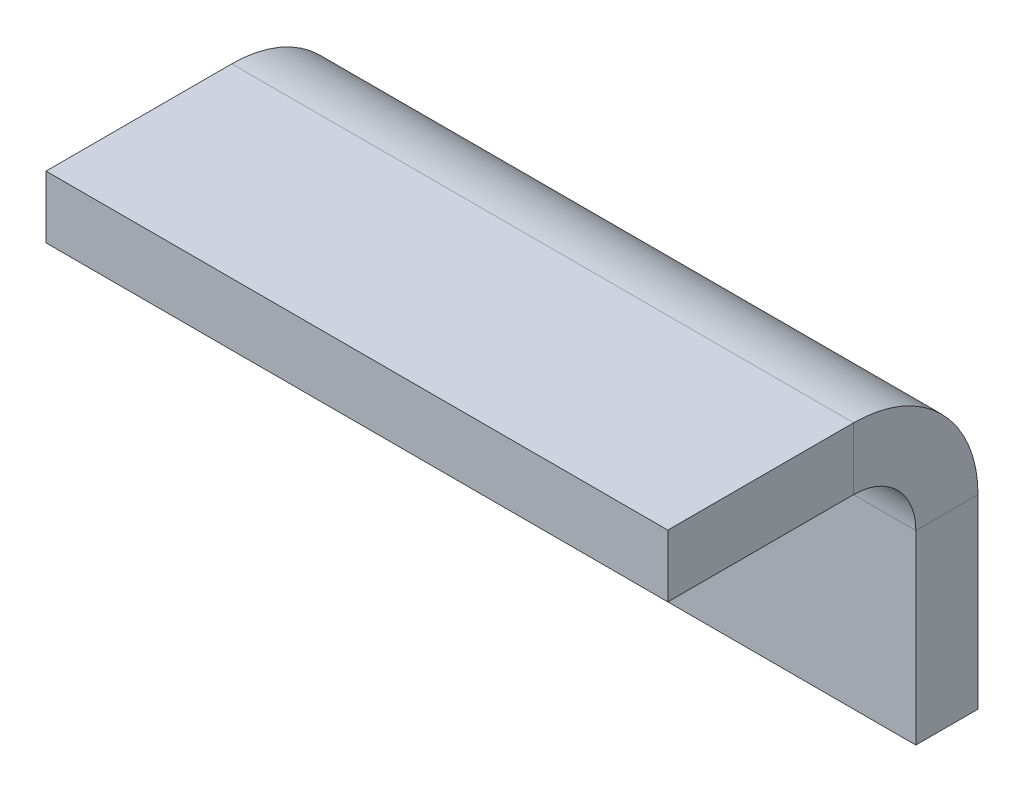
ISO-10303-21;
HEADER;
FILE_DESCRIPTION(('STEP AP214'),'2;1');
FILE_NAME('part.step','',(''),(''),'','','');
FILE_SCHEMA(('AUTOMOTIVE_DESIGN { 1 0 10303 214 1 1 1 1 }'));
ENDSEC;
DATA;
#1=APPLICATION_CONTEXT('core data for automotive mechanical design processes');
#2=APPLICATION_PROTOCOL_DEFINITION('international standard','automotive_design',2000,#1);
#3=PRODUCT_CONTEXT('',#1,'mechanical');
#4=PRODUCT('Part','Part','',(#3));
#5=PRODUCT_RELATED_PRODUCT_CATEGORY('part','',(#4));
#6=PRODUCT_DEFINITION_FORMATION('','',#4);
#7=PRODUCT_DEFINITION_CONTEXT('part definition',#1,'design');
#8=PRODUCT_DEFINITION('design','',#6,#7);
#9=PRODUCT_DEFINITION_SHAPE('','',#8);
#10=(LENGTH_UNIT() NAMED_UNIT(*) SI_UNIT(.MILLI.,.METRE.));
#11=(NAMED_UNIT(*) PLANE_ANGLE_UNIT() SI_UNIT($,.RADIAN.));
#12=(NAMED_UNIT(*) SI_UNIT($,.STERADIAN.) SOLID_ANGLE_UNIT());
#13=UNCERTAINTY_MEASURE_WITH_UNIT(LENGTH_MEASURE(1.E-05),#10,'distance_accuracy_value','');
#14=(GEOMETRIC_REPRESENTATION_CONTEXT(3) GLOBAL_UNCERTAINTY_ASSIGNED_CONTEXT((#13)) GLOBAL_UNIT_ASSIGNED_CONTEXT((#10,
#11,#12)) REPRESENTATION_CONTEXT('',''));
#15=CARTESIAN_POINT('',(0.,0.,0.));
#16=DIRECTION('',(0.,0.,1.));
#17=DIRECTION('',(1.,0.,0.));
#18=AXIS2_PLACEMENT_3D('',#15,#16,#17);
#19=CARTESIAN_POINT('',(0.,2.4657082647115,-0.534291735288522));
#20=DIRECTION('',(0.,-1.,0.));
#21=DIRECTION('',(1.,0.,0.));
#22=AXIS2_PLACEMENT_3D('',#19,#20,#21);
#23=PLANE('',#22);
#24=DIRECTION('',(0.,0.,1.));
#25=VECTOR('',#24,1.);
#26=CARTESIAN_POINT('',(15.,2.46570826471146,11.9657082647115));
#27=LINE('',#26,#25);
#28=CARTESIAN_POINT('',(15.,2.46570826471149,3.00000000000002));
#29=VERTEX_POINT('',#28);
#30=CARTESIAN_POINT('',(15.,2.46570826471146,11.9657082647115));
#31=VERTEX_POINT('',#30);
#32=EDGE_CURVE('E42',#29,#31,#27,.T.);
#33=ORIENTED_EDGE('',*,*,#32,.F.);
#34=DIRECTION('',(-1.,0.,0.));
#35=VECTOR('',#34,1.);
#36=CARTESIAN_POINT('',(0.,2.46570826471149,3.00000000000002));
#37=LINE('',#36,#35);
#38=CARTESIAN_POINT('',(-15.,2.46570826471149,3.00000000000002));
#39=VERTEX_POINT('',#38);
#40=EDGE_CURVE('E129',#29,#39,#37,.T.);
#41=ORIENTED_EDGE('',*,*,#40,.T.);
#42=DIRECTION('',(0.,0.,-1.));
#43=VECTOR('',#42,1.);
#44=CARTESIAN_POINT('',(-15.,2.46570826471146,11.9657082647115));
#45=LINE('',#44,#43);
#46=CARTESIAN_POINT('',(-15.,2.46570826471146,11.9657082647115));
#47=VERTEX_POINT('',#46);
#48=EDGE_CURVE('E156',#47,#39,#45,.T.);
#49=ORIENTED_EDGE('',*,*,#48,.F.);
#50=DIRECTION('',(-1.,0.,0.));
#51=VECTOR('',#50,1.);
#52=CARTESIAN_POINT('',(-15.,2.46570826471146,11.9657082647115));
#53=LINE('',#52,#51);
#54=EDGE_CURVE('E150',#31,#47,#53,.T.);
#55=ORIENTED_EDGE('',*,*,#54,.F.);
#56=EDGE_LOOP('',(#33,#41,#49,#55));
#57=FACE_BOUND('',#56,.T.);
#58=ADVANCED_FACE('F38',(#57),#23,.F.);
#59=CARTESIAN_POINT('',(-15.,2.46570826471146,11.9657082647115));
#60=DIRECTION('',(-1.,0.,0.));
#61=DIRECTION('',(0.,0.,-1.));
#62=AXIS2_PLACEMENT_3D('',#59,#60,#61);
#63=PLANE('',#62);
#64=DIRECTION('',(0.,1.,0.));
#65=VECTOR('',#64,1.);
#66=CARTESIAN_POINT('',(-15.,2.46570826471156,3.00000000000002));
#67=LINE('',#66,#65);
#68=CARTESIAN_POINT('',(-15.,-0.534291735288507,2.99999999999999));
#69=VERTEX_POINT('',#68);
#70=EDGE_CURVE('E12',#69,#39,#67,.T.);
#71=ORIENTED_EDGE('',*,*,#70,.F.);
#72=DIRECTION('',(0.,0.,-1.));
#73=VECTOR('',#72,1.);
#74=CARTESIAN_POINT('',(-15.,-0.534291735288539,11.9657082647115));
#75=LINE('',#74,#73);
#76=CARTESIAN_POINT('',(-15.,-0.534291735288539,11.9657082647115));
#77=VERTEX_POINT('',#76);
#78=EDGE_CURVE('E55',#77,#69,#75,.T.);
#79=ORIENTED_EDGE('',*,*,#78,.F.);
#80=DIRECTION('',(0.,-1.,0.));
#81=VECTOR('',#80,1.);
#82=CARTESIAN_POINT('',(-15.,2.46570826471146,11.9657082647115));
#83=LINE('',#82,#81);
#84=EDGE_CURVE('E157',#47,#77,#83,.T.);
#85=ORIENTED_EDGE('',*,*,#84,.F.);
#86=ORIENTED_EDGE('',*,*,#48,.T.);
#87=EDGE_LOOP('',(#71,#79,#85,#86));
#88=FACE_BOUND('',#87,.T.);
#89=ADVANCED_FACE('F40',(#88),#63,.T.);
#90=CARTESIAN_POINT('',(-15.,2.46570826471146,11.9657082647115));
#91=DIRECTION('',(0.,0.,1.));
#92=DIRECTION('',(0.,-1.,0.));
#93=AXIS2_PLACEMENT_3D('',#90,#91,#92);
#94=PLANE('',#93);
#95=DIRECTION('',(-1.,0.,0.));
#96=VECTOR('',#95,1.);
#97=CARTESIAN_POINT('',(-15.,-0.534291735288539,11.9657082647115));
#98=LINE('',#97,#96);
#99=CARTESIAN_POINT('',(15.,-0.534291735288539,11.9657082647115));
#100=VERTEX_POINT('',#99);
#101=EDGE_CURVE('E154',#100,#77,#98,.T.);
#102=ORIENTED_EDGE('',*,*,#101,.F.);
#103=DIRECTION('',(0.,-1.,0.));
#104=VECTOR('',#103,1.);
#105=CARTESIAN_POINT('',(15.,2.46570826471146,11.9657082647115));
#106=LINE('',#105,#104);
#107=EDGE_CURVE('E153',#31,#100,#106,.T.);
#108=ORIENTED_EDGE('',*,*,#107,.F.);
#109=ORIENTED_EDGE('',*,*,#54,.T.);
#110=ORIENTED_EDGE('',*,*,#84,.T.);
#111=EDGE_LOOP('',(#102,#108,#109,#110));
#112=FACE_BOUND('',#111,.T.);
#113=ADVANCED_FACE('F173',(#112),#94,.T.);
#114=CARTESIAN_POINT('',(15.,2.46570826471146,11.9657082647115));
#115=DIRECTION('',(1.,0.,0.));
#116=DIRECTION('',(0.,0.,1.));
#117=AXIS2_PLACEMENT_3D('',#114,#115,#116);
#118=PLANE('',#117);
#119=DIRECTION('',(0.,-1.,0.));
#120=VECTOR('',#119,1.);
#121=CARTESIAN_POINT('',(15.,2.46570826471156,3.00000000000002));
#122=LINE('',#121,#120);
#123=CARTESIAN_POINT('',(15.,-0.534291735288507,2.99999999999999));
#124=VERTEX_POINT('',#123);
#125=EDGE_CURVE('E161',#29,#124,#122,.T.);
#126=ORIENTED_EDGE('',*,*,#125,.F.);
#127=ORIENTED_EDGE('',*,*,#32,.T.);
#128=ORIENTED_EDGE('',*,*,#107,.T.);
#129=DIRECTION('',(0.,0.,1.));
#130=VECTOR('',#129,1.);
#131=CARTESIAN_POINT('',(15.,-0.534291735288539,11.9657082647115));
#132=LINE('',#131,#130);
#133=EDGE_CURVE('E63',#124,#100,#132,.T.);
#134=ORIENTED_EDGE('',*,*,#133,.F.);
#135=EDGE_LOOP('',(#126,#127,#128,#134));
#136=FACE_BOUND('',#135,.T.);
#137=ADVANCED_FACE('F170',(#136),#118,.T.);
#138=CARTESIAN_POINT('',(0.,-0.534291735288495,-0.534291735288532));
#139=DIRECTION('',(0.,-1.,0.));
#140=DIRECTION('',(1.,0.,0.));
#141=AXIS2_PLACEMENT_3D('',#138,#139,#140);
#142=PLANE('',#141);
#143=DIRECTION('',(-1.,0.,0.));
#144=VECTOR('',#143,1.);
#145=CARTESIAN_POINT('',(0.,-0.534291735288507,2.99999999999999));
#146=LINE('',#145,#144);
#147=EDGE_CURVE('E47',#124,#69,#146,.T.);
#148=ORIENTED_EDGE('',*,*,#147,.F.);
#149=ORIENTED_EDGE('',*,*,#133,.T.);
#150=ORIENTED_EDGE('',*,*,#101,.T.);
#151=ORIENTED_EDGE('',*,*,#78,.T.);
#152=EDGE_LOOP('',(#148,#149,#150,#151));
#153=FACE_BOUND('',#152,.T.);
#154=ADVANCED_FACE('F167',(#153),#142,.T.);
#155=CARTESIAN_POINT('',(-15.,-12.5,-3.));
#156=DIRECTION('',(0.,-1.,0.));
#157=DIRECTION('',(0.,0.,-1.));
#158=AXIS2_PLACEMENT_3D('',#155,#156,#157);
#159=PLANE('',#158);
#160=DIRECTION('',(1.,0.,0.));
#161=VECTOR('',#160,1.);
#162=CARTESIAN_POINT('',(-15.,-12.5,0.));
#163=LINE('',#162,#161);
#164=CARTESIAN_POINT('',(-15.,-12.5,0.));
#165=VERTEX_POINT('',#164);
#166=CARTESIAN_POINT('',(15.,-12.5,0.));
#167=VERTEX_POINT('',#166);
#168=EDGE_CURVE('E195',#165,#167,#163,.T.);
#169=ORIENTED_EDGE('',*,*,#168,.F.);
#170=DIRECTION('',(0.,0.,1.));
#171=VECTOR('',#170,1.);
#172=CARTESIAN_POINT('',(-15.,-12.5,-3.));
#173=LINE('',#172,#171);
#174=CARTESIAN_POINT('',(-15.,-12.5,-3.));
#175=VERTEX_POINT('',#174);
#176=EDGE_CURVE('E166',#175,#165,#173,.T.);
#177=ORIENTED_EDGE('',*,*,#176,.F.);
#178=DIRECTION('',(1.,0.,0.));
#179=VECTOR('',#178,1.);
#180=CARTESIAN_POINT('',(-15.,-12.5,-3.));
#181=LINE('',#180,#179);
#182=CARTESIAN_POINT('',(15.,-12.5,-3.));
#183=VERTEX_POINT('',#182);
#184=EDGE_CURVE('E141',#175,#183,#181,.T.);
#185=ORIENTED_EDGE('',*,*,#184,.T.);
#186=DIRECTION('',(0.,0.,1.));
#187=VECTOR('',#186,1.);
#188=CARTESIAN_POINT('',(15.,-12.5,-3.));
#189=LINE('',#188,#187);
#190=EDGE_CURVE('E144',#183,#167,#189,.T.);
#191=ORIENTED_EDGE('',*,*,#190,.T.);
#192=EDGE_LOOP('',(#169,#177,#185,#191));
#193=FACE_BOUND('',#192,.T.);
#194=ADVANCED_FACE('F205',(#193),#159,.T.);
#195=CARTESIAN_POINT('',(0.,0.,-3.));
#196=DIRECTION('',(0.,0.,1.));
#197=DIRECTION('',(1.,0.,0.));
#198=AXIS2_PLACEMENT_3D('',#195,#196,#197);
#199=PLANE('',#198);
#200=DIRECTION('',(-1.,0.,0.));
#201=VECTOR('',#200,1.);
#202=CARTESIAN_POINT('',(0.,-3.53429173528851,-3.));
#203=LINE('',#202,#201);
#204=CARTESIAN_POINT('',(15.,-3.53429173528851,-3.));
#205=VERTEX_POINT('',#204);
#206=CARTESIAN_POINT('',(-15.,-3.53429173528851,-3.));
#207=VERTEX_POINT('',#206);
#208=EDGE_CURVE('E126',#205,#207,#203,.T.);
#209=ORIENTED_EDGE('',*,*,#208,.F.);
#210=DIRECTION('',(0.,1.,0.));
#211=VECTOR('',#210,1.);
#212=CARTESIAN_POINT('',(15.,12.5,-3.));
#213=LINE('',#212,#211);
#214=EDGE_CURVE('E120',#183,#205,#213,.T.);
#215=ORIENTED_EDGE('',*,*,#214,.F.);
#216=ORIENTED_EDGE('',*,*,#184,.F.);
#217=DIRECTION('',(0.,-1.,0.));
#218=VECTOR('',#217,1.);
#219=CARTESIAN_POINT('',(-15.,12.5,-3.));
#220=LINE('',#219,#218);
#221=EDGE_CURVE('E139',#207,#175,#220,.T.);
#222=ORIENTED_EDGE('',*,*,#221,.F.);
#223=EDGE_LOOP('',(#209,#215,#216,#222));
#224=FACE_BOUND('',#223,.T.);
#225=ADVANCED_FACE('F136',(#224),#199,.F.);
#226=CARTESIAN_POINT('',(15.,12.5,-3.));
#227=DIRECTION('',(1.,0.,0.));
#228=DIRECTION('',(0.,1.,0.));
#229=AXIS2_PLACEMENT_3D('',#226,#227,#228);
#230=PLANE('',#229);
#231=ORIENTED_EDGE('',*,*,#214,.T.);
#232=DIRECTION('',(0.,0.,1.));
#233=VECTOR('',#232,1.);
#234=CARTESIAN_POINT('',(15.,-3.53429173528851,-3.00000000000011));
#235=LINE('',#234,#233);
#236=CARTESIAN_POINT('',(15.,-3.53429173528852,0.));
#237=VERTEX_POINT('',#236);
#238=EDGE_CURVE('E107',#205,#237,#235,.T.);
#239=ORIENTED_EDGE('',*,*,#238,.T.);
#240=DIRECTION('',(0.,1.,0.));
#241=VECTOR('',#240,1.);
#242=CARTESIAN_POINT('',(15.,12.5,0.));
#243=LINE('',#242,#241);
#244=EDGE_CURVE('E119',#167,#237,#243,.T.);
#245=ORIENTED_EDGE('',*,*,#244,.F.);
#246=ORIENTED_EDGE('',*,*,#190,.F.);
#247=EDGE_LOOP('',(#231,#239,#245,#246));
#248=FACE_BOUND('',#247,.T.);
#249=ADVANCED_FACE('F143',(#248),#230,.T.);
#250=CARTESIAN_POINT('',(0.,0.,0.));
#251=DIRECTION('',(0.,0.,1.));
#252=DIRECTION('',(1.,0.,0.));
#253=AXIS2_PLACEMENT_3D('',#250,#251,#252);
#254=PLANE('',#253);
#255=ORIENTED_EDGE('',*,*,#244,.T.);
#256=DIRECTION('',(-1.,0.,0.));
#257=VECTOR('',#256,1.);
#258=CARTESIAN_POINT('',(0.,-3.53429173528853,0.));
#259=LINE('',#258,#257);
#260=CARTESIAN_POINT('',(-15.,-3.53429173528851,0.));
#261=VERTEX_POINT('',#260);
#262=EDGE_CURVE('E186',#237,#261,#259,.T.);
#263=ORIENTED_EDGE('',*,*,#262,.T.);
#264=DIRECTION('',(0.,-1.,0.));
#265=VECTOR('',#264,1.);
#266=CARTESIAN_POINT('',(-15.,12.5,0.));
#267=LINE('',#266,#265);
#268=EDGE_CURVE('E198',#261,#165,#267,.T.);
#269=ORIENTED_EDGE('',*,*,#268,.T.);
#270=ORIENTED_EDGE('',*,*,#168,.T.);
#271=EDGE_LOOP('',(#255,#263,#269,#270));
#272=FACE_BOUND('',#271,.T.);
#273=ADVANCED_FACE('F201',(#272),#254,.T.);
#274=CARTESIAN_POINT('',(-15.,12.5,-3.));
#275=DIRECTION('',(-1.,0.,0.));
#276=DIRECTION('',(0.,-1.,0.));
#277=AXIS2_PLACEMENT_3D('',#274,#275,#276);
#278=PLANE('',#277);
#279=ORIENTED_EDGE('',*,*,#268,.F.);
#280=DIRECTION('',(0.,0.,-1.));
#281=VECTOR('',#280,1.);
#282=CARTESIAN_POINT('',(-15.,-3.53429173528851,-3.00000000000011));
#283=LINE('',#282,#281);
#284=EDGE_CURVE('E180',#261,#207,#283,.T.);
#285=ORIENTED_EDGE('',*,*,#284,.T.);
#286=ORIENTED_EDGE('',*,*,#221,.T.);
#287=ORIENTED_EDGE('',*,*,#176,.T.);
#288=EDGE_LOOP('',(#279,#285,#286,#287));
#289=FACE_BOUND('',#288,.T.);
#290=ADVANCED_FACE('F207',(#289),#278,.T.);
#291=CARTESIAN_POINT('',(15.,-3.53429173528851,3.));
#292=DIRECTION('',(1.,0.,0.));
#293=DIRECTION('',(0.,0.,-1.));
#294=AXIS2_PLACEMENT_3D('',#291,#292,#293);
#295=PLANE('',#294);
#296=ORIENTED_EDGE('',*,*,#125,.T.);
#297=CARTESIAN_POINT('',(15.,-3.53429173528851,3.));
#298=DIRECTION('',(1.,0.,0.));
#299=DIRECTION('',(0.,0.,-1.));
#300=AXIS2_PLACEMENT_3D('',#297,#298,#299);
#301=CIRCLE('',#300,3.);
#302=EDGE_CURVE('E114',#124,#237,#301,.F.);
#303=ORIENTED_EDGE('',*,*,#302,.T.);
#304=ORIENTED_EDGE('',*,*,#238,.F.);
#305=CARTESIAN_POINT('',(15.,-3.53429173528851,3.));
#306=DIRECTION('',(-1.,0.,0.));
#307=DIRECTION('',(0.,0.,-1.));
#308=AXIS2_PLACEMENT_3D('',#305,#306,#307);
#309=CIRCLE('',#308,6.);
#310=EDGE_CURVE('E111',#29,#205,#309,.T.);
#311=ORIENTED_EDGE('',*,*,#310,.F.);
#312=EDGE_LOOP('',(#296,#303,#304,#311));
#313=FACE_BOUND('',#312,.T.);
#314=ADVANCED_FACE('F110',(#313),#295,.T.);
#315=CARTESIAN_POINT('',(-15.,-3.53429173528851,3.));
#316=DIRECTION('',(-1.,0.,0.));
#317=DIRECTION('',(0.,0.,1.));
#318=AXIS2_PLACEMENT_3D('',#315,#316,#317);
#319=PLANE('',#318);
#320=ORIENTED_EDGE('',*,*,#284,.F.);
#321=CARTESIAN_POINT('',(-15.,-3.53429173528851,3.));
#322=DIRECTION('',(1.,0.,0.));
#323=DIRECTION('',(0.,0.,-1.));
#324=AXIS2_PLACEMENT_3D('',#321,#322,#323);
#325=CIRCLE('',#324,3.);
#326=EDGE_CURVE('E131',#261,#69,#325,.T.);
#327=ORIENTED_EDGE('',*,*,#326,.T.);
#328=ORIENTED_EDGE('',*,*,#70,.T.);
#329=CARTESIAN_POINT('',(-15.,-3.53429173528851,3.));
#330=DIRECTION('',(1.,0.,0.));
#331=DIRECTION('',(0.,0.,1.));
#332=AXIS2_PLACEMENT_3D('',#329,#330,#331);
#333=CIRCLE('',#332,6.);
#334=EDGE_CURVE('E130',#207,#39,#333,.T.);
#335=ORIENTED_EDGE('',*,*,#334,.F.);
#336=EDGE_LOOP('',(#320,#327,#328,#335));
#337=FACE_BOUND('',#336,.T.);
#338=ADVANCED_FACE('F179',(#337),#319,.T.);
#339=CARTESIAN_POINT('',(-30.9671579625983,-3.53429173528851,3.));
#340=DIRECTION('',(1.,0.,0.));
#341=DIRECTION('',(0.,0.,-1.));
#342=AXIS2_PLACEMENT_3D('',#339,#340,#341);
#343=CYLINDRICAL_SURFACE('',#342,6.);
#344=ORIENTED_EDGE('',*,*,#334,.T.);
#345=ORIENTED_EDGE('',*,*,#40,.F.);
#346=ORIENTED_EDGE('',*,*,#310,.T.);
#347=ORIENTED_EDGE('',*,*,#208,.T.);
#348=EDGE_LOOP('',(#344,#345,#346,#347));
#349=FACE_BOUND('',#348,.T.);
#350=ADVANCED_FACE('F125',(#349),#343,.T.);
#351=CARTESIAN_POINT('',(-30.9671579625983,-3.53429173528851,3.));
#352=DIRECTION('',(1.,0.,0.));
#353=DIRECTION('',(0.,0.,-1.));
#354=AXIS2_PLACEMENT_3D('',#351,#352,#353);
#355=CYLINDRICAL_SURFACE('',#354,3.);
#356=ORIENTED_EDGE('',*,*,#326,.F.);
#357=ORIENTED_EDGE('',*,*,#262,.F.);
#358=ORIENTED_EDGE('',*,*,#302,.F.);
#359=ORIENTED_EDGE('',*,*,#147,.T.);
#360=EDGE_LOOP('',(#356,#357,#358,#359));
#361=FACE_BOUND('',#360,.T.);
#362=ADVANCED_FACE('F184',(#361),#355,.F.);
#363=CLOSED_SHELL('',(#58,#89,#113,#137,#154,#194,#225,#249,#273,#290,#314,#338,#350,#362));
#364=MANIFOLD_SOLID_BREP('B2',#363);
#365=ADVANCED_BREP_SHAPE_REPRESENTATION('',(#18,#364),#14);
#366=SHAPE_DEFINITION_REPRESENTATION(#9,#365);
ENDSEC;
END-ISO-10303-21;
